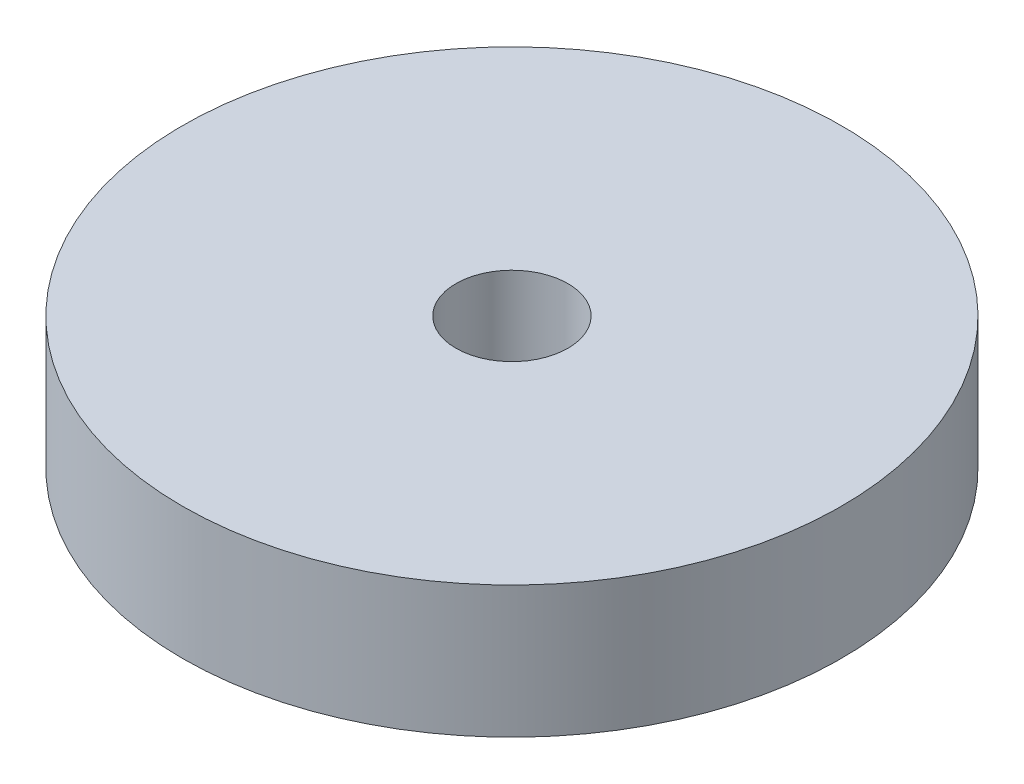
ISO-10303-21;
HEADER;
FILE_DESCRIPTION(('STEP AP214'),'2;1');
FILE_NAME('part.step','',(''),(''),'','','');
FILE_SCHEMA(('AUTOMOTIVE_DESIGN { 1 0 10303 214 1 1 1 1 }'));
ENDSEC;
DATA;
#1=APPLICATION_CONTEXT('core data for automotive mechanical design processes');
#2=APPLICATION_PROTOCOL_DEFINITION('international standard','automotive_design',2000,#1);
#3=PRODUCT_CONTEXT('',#1,'mechanical');
#4=PRODUCT('Part','Part','',(#3));
#5=PRODUCT_RELATED_PRODUCT_CATEGORY('part','',(#4));
#6=PRODUCT_DEFINITION_FORMATION('','',#4);
#7=PRODUCT_DEFINITION_CONTEXT('part definition',#1,'design');
#8=PRODUCT_DEFINITION('design','',#6,#7);
#9=PRODUCT_DEFINITION_SHAPE('','',#8);
#10=(LENGTH_UNIT() NAMED_UNIT(*) SI_UNIT(.MILLI.,.METRE.));
#11=(NAMED_UNIT(*) PLANE_ANGLE_UNIT() SI_UNIT($,.RADIAN.));
#12=(NAMED_UNIT(*) SI_UNIT($,.STERADIAN.) SOLID_ANGLE_UNIT());
#13=UNCERTAINTY_MEASURE_WITH_UNIT(LENGTH_MEASURE(1.E-05),#10,'distance_accuracy_value','');
#14=(GEOMETRIC_REPRESENTATION_CONTEXT(3) GLOBAL_UNCERTAINTY_ASSIGNED_CONTEXT((#13)) GLOBAL_UNIT_ASSIGNED_CONTEXT((#10,
#11,#12)) REPRESENTATION_CONTEXT('',''));
#15=CARTESIAN_POINT('',(0.,0.,0.));
#16=DIRECTION('',(0.,0.,1.));
#17=DIRECTION('',(1.,0.,0.));
#18=AXIS2_PLACEMENT_3D('',#15,#16,#17);
#19=CARTESIAN_POINT('',(0.,10.,0.));
#20=DIRECTION('',(0.,1.,0.));
#21=DIRECTION('',(0.,0.,1.));
#22=AXIS2_PLACEMENT_3D('',#19,#20,#21);
#23=PLANE('',#22);
#24=CARTESIAN_POINT('',(0.,10.,0.));
#25=DIRECTION('',(0.,1.,0.));
#26=DIRECTION('',(0.,0.,1.));
#27=AXIS2_PLACEMENT_3D('',#24,#25,#26);
#28=CIRCLE('',#27,25.);
#29=CARTESIAN_POINT('',(0.,10.,25.));
#30=VERTEX_POINT('',#29);
#31=EDGE_CURVE('E10',#30,#30,#28,.T.);
#32=ORIENTED_EDGE('',*,*,#31,.T.);
#33=EDGE_LOOP('',(#32));
#34=FACE_BOUND('',#33,.T.);
#35=CARTESIAN_POINT('',(0.,10.,0.));
#36=DIRECTION('',(0.,1.,0.));
#37=DIRECTION('',(0.,0.,1.));
#38=AXIS2_PLACEMENT_3D('',#35,#36,#37);
#39=CIRCLE('',#38,4.25);
#40=CARTESIAN_POINT('',(0.,10.,4.25));
#41=VERTEX_POINT('',#40);
#42=EDGE_CURVE('E42',#41,#41,#39,.T.);
#43=ORIENTED_EDGE('',*,*,#42,.F.);
#44=EDGE_LOOP('',(#43));
#45=FACE_BOUND('',#44,.T.);
#46=ADVANCED_FACE('F31',(#34,#45),#23,.T.);
#47=CARTESIAN_POINT('',(0.,0.,0.));
#48=DIRECTION('',(0.,1.,0.));
#49=DIRECTION('',(0.,0.,1.));
#50=AXIS2_PLACEMENT_3D('',#47,#48,#49);
#51=PLANE('',#50);
#52=CARTESIAN_POINT('',(0.,0.,0.));
#53=DIRECTION('',(0.,1.,0.));
#54=DIRECTION('',(0.,0.,1.));
#55=AXIS2_PLACEMENT_3D('',#52,#53,#54);
#56=CIRCLE('',#55,25.);
#57=CARTESIAN_POINT('',(0.,0.,25.));
#58=VERTEX_POINT('',#57);
#59=EDGE_CURVE('E35',#58,#58,#56,.T.);
#60=ORIENTED_EDGE('',*,*,#59,.F.);
#61=EDGE_LOOP('',(#60));
#62=FACE_BOUND('',#61,.T.);
#63=CARTESIAN_POINT('',(0.,0.,0.));
#64=DIRECTION('',(0.,1.,0.));
#65=DIRECTION('',(0.,0.,1.));
#66=AXIS2_PLACEMENT_3D('',#63,#64,#65);
#67=CIRCLE('',#66,4.25);
#68=CARTESIAN_POINT('',(0.,0.,4.25));
#69=VERTEX_POINT('',#68);
#70=EDGE_CURVE('E44',#69,#69,#67,.T.);
#71=ORIENTED_EDGE('',*,*,#70,.T.);
#72=EDGE_LOOP('',(#71));
#73=FACE_BOUND('',#72,.T.);
#74=ADVANCED_FACE('F54',(#62,#73),#51,.F.);
#75=CARTESIAN_POINT('',(0.,10.,0.));
#76=DIRECTION('',(0.,-1.,0.));
#77=DIRECTION('',(0.,0.,-1.));
#78=AXIS2_PLACEMENT_3D('',#75,#76,#77);
#79=CYLINDRICAL_SURFACE('',#78,25.);
#80=ORIENTED_EDGE('',*,*,#31,.F.);
#81=EDGE_LOOP('',(#80));
#82=FACE_BOUND('',#81,.T.);
#83=ORIENTED_EDGE('',*,*,#59,.T.);
#84=EDGE_LOOP('',(#83));
#85=FACE_BOUND('',#84,.T.);
#86=ADVANCED_FACE('F33',(#82,#85),#79,.T.);
#87=CARTESIAN_POINT('',(0.,10.,0.));
#88=DIRECTION('',(0.,-1.,0.));
#89=DIRECTION('',(0.,0.,-1.));
#90=AXIS2_PLACEMENT_3D('',#87,#88,#89);
#91=CYLINDRICAL_SURFACE('',#90,4.25);
#92=ORIENTED_EDGE('',*,*,#42,.T.);
#93=EDGE_LOOP('',(#92));
#94=FACE_BOUND('',#93,.T.);
#95=ORIENTED_EDGE('',*,*,#70,.F.);
#96=EDGE_LOOP('',(#95));
#97=FACE_BOUND('',#96,.T.);
#98=ADVANCED_FACE('F50',(#94,#97),#91,.F.);
#99=CLOSED_SHELL('',(#46,#74,#86,#98));
#100=MANIFOLD_SOLID_BREP('B2',#99);
#101=ADVANCED_BREP_SHAPE_REPRESENTATION('',(#18,#100),#14);
#102=SHAPE_DEFINITION_REPRESENTATION(#9,#101);
ENDSEC;
END-ISO-10303-21;
